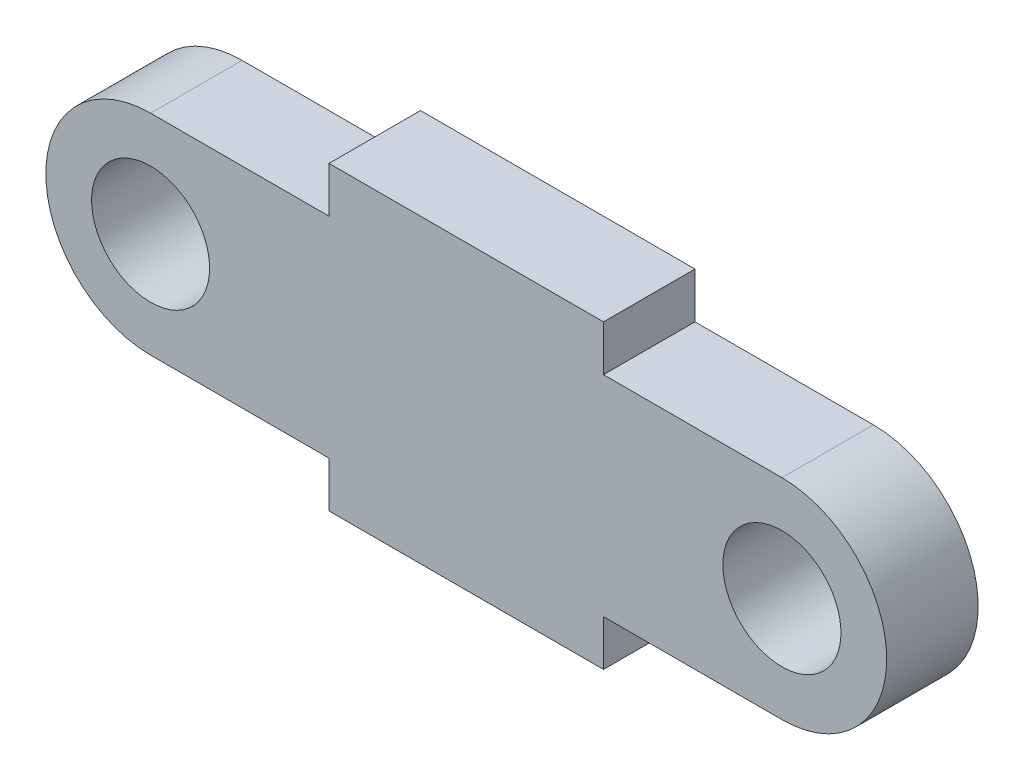
ISO-10303-21;
HEADER;
FILE_DESCRIPTION(('STEP AP214'),'2;1');
FILE_NAME('part.step','',(''),(''),'','','');
FILE_SCHEMA(('AUTOMOTIVE_DESIGN { 1 0 10303 214 1 1 1 1 }'));
ENDSEC;
DATA;
#1=APPLICATION_CONTEXT('core data for automotive mechanical design processes');
#2=APPLICATION_PROTOCOL_DEFINITION('international standard','automotive_design',2000,#1);
#3=PRODUCT_CONTEXT('',#1,'mechanical');
#4=PRODUCT('Part','Part','',(#3));
#5=PRODUCT_RELATED_PRODUCT_CATEGORY('part','',(#4));
#6=PRODUCT_DEFINITION_FORMATION('','',#4);
#7=PRODUCT_DEFINITION_CONTEXT('part definition',#1,'design');
#8=PRODUCT_DEFINITION('design','',#6,#7);
#9=PRODUCT_DEFINITION_SHAPE('','',#8);
#10=(LENGTH_UNIT() NAMED_UNIT(*) SI_UNIT(.MILLI.,.METRE.));
#11=(NAMED_UNIT(*) PLANE_ANGLE_UNIT() SI_UNIT($,.RADIAN.));
#12=(NAMED_UNIT(*) SI_UNIT($,.STERADIAN.) SOLID_ANGLE_UNIT());
#13=UNCERTAINTY_MEASURE_WITH_UNIT(LENGTH_MEASURE(1.E-05),#10,'distance_accuracy_value','');
#14=(GEOMETRIC_REPRESENTATION_CONTEXT(3) GLOBAL_UNCERTAINTY_ASSIGNED_CONTEXT((#13)) GLOBAL_UNIT_ASSIGNED_CONTEXT((#10,
#11,#12)) REPRESENTATION_CONTEXT('',''));
#15=CARTESIAN_POINT('',(0.,0.,0.));
#16=DIRECTION('',(0.,0.,1.));
#17=DIRECTION('',(1.,0.,0.));
#18=AXIS2_PLACEMENT_3D('',#15,#16,#17);
#19=CARTESIAN_POINT('',(-39.6175214332808,0.,-10.));
#20=DIRECTION('',(0.,0.,1.));
#21=DIRECTION('',(1.,0.,0.));
#22=AXIS2_PLACEMENT_3D('',#19,#20,#21);
#23=CYLINDRICAL_SURFACE('',#22,11.45);
#24=CARTESIAN_POINT('',(-39.6175214332808,0.,0.));
#25=DIRECTION('',(0.,0.,1.));
#26=DIRECTION('',(1.,0.,0.));
#27=AXIS2_PLACEMENT_3D('',#24,#25,#26);
#28=CIRCLE('',#27,11.45);
#29=CARTESIAN_POINT('',(-39.6175214332808,11.45,0.));
#30=VERTEX_POINT('',#29);
#31=CARTESIAN_POINT('',(-39.6175214332808,-11.45,0.));
#32=VERTEX_POINT('',#31);
#33=EDGE_CURVE('E166',#30,#32,#28,.T.);
#34=ORIENTED_EDGE('',*,*,#33,.F.);
#35=DIRECTION('',(0.,0.,1.));
#36=VECTOR('',#35,1.);
#37=CARTESIAN_POINT('',(-39.6175214332808,11.45,-10.));
#38=LINE('',#37,#36);
#39=CARTESIAN_POINT('',(-39.6175214332808,11.45,-10.));
#40=VERTEX_POINT('',#39);
#41=EDGE_CURVE('E11',#40,#30,#38,.T.);
#42=ORIENTED_EDGE('',*,*,#41,.F.);
#43=CARTESIAN_POINT('',(-39.6175214332808,0.,-10.));
#44=DIRECTION('',(0.,0.,1.));
#45=DIRECTION('',(1.,0.,0.));
#46=AXIS2_PLACEMENT_3D('',#43,#44,#45);
#47=CIRCLE('',#46,11.45);
#48=CARTESIAN_POINT('',(-39.6175214332808,-11.45,-10.));
#49=VERTEX_POINT('',#48);
#50=EDGE_CURVE('E211',#40,#49,#47,.T.);
#51=ORIENTED_EDGE('',*,*,#50,.T.);
#52=DIRECTION('',(0.,0.,1.));
#53=VECTOR('',#52,1.);
#54=CARTESIAN_POINT('',(-39.6175214332808,-11.45,-10.));
#55=LINE('',#54,#53);
#56=EDGE_CURVE('E42',#49,#32,#55,.T.);
#57=ORIENTED_EDGE('',*,*,#56,.T.);
#58=EDGE_LOOP('',(#34,#42,#51,#57));
#59=FACE_BOUND('',#58,.T.);
#60=ADVANCED_FACE('F39',(#59),#23,.T.);
#61=CARTESIAN_POINT('',(-39.6175214332808,11.45,-10.));
#62=DIRECTION('',(0.,1.,0.));
#63=DIRECTION('',(-1.,0.,0.));
#64=AXIS2_PLACEMENT_3D('',#61,#62,#63);
#65=PLANE('',#64);
#66=DIRECTION('',(-1.,0.,0.));
#67=VECTOR('',#66,1.);
#68=CARTESIAN_POINT('',(-39.6175214332808,11.45,0.));
#69=LINE('',#68,#67);
#70=CARTESIAN_POINT('',(-20.1175214332808,11.45,0.));
#71=VERTEX_POINT('',#70);
#72=EDGE_CURVE('E208',#71,#30,#69,.T.);
#73=ORIENTED_EDGE('',*,*,#72,.F.);
#74=DIRECTION('',(0.,0.,1.));
#75=VECTOR('',#74,1.);
#76=CARTESIAN_POINT('',(-20.1175214332808,11.45,-10.));
#77=LINE('',#76,#75);
#78=CARTESIAN_POINT('',(-20.1175214332808,11.45,-10.));
#79=VERTEX_POINT('',#78);
#80=EDGE_CURVE('E49',#79,#71,#77,.T.);
#81=ORIENTED_EDGE('',*,*,#80,.F.);
#82=DIRECTION('',(-1.,0.,0.));
#83=VECTOR('',#82,1.);
#84=CARTESIAN_POINT('',(-39.6175214332808,11.45,-10.));
#85=LINE('',#84,#83);
#86=EDGE_CURVE('E152',#79,#40,#85,.T.);
#87=ORIENTED_EDGE('',*,*,#86,.T.);
#88=ORIENTED_EDGE('',*,*,#41,.T.);
#89=EDGE_LOOP('',(#73,#81,#87,#88));
#90=FACE_BOUND('',#89,.T.);
#91=ADVANCED_FACE('F241',(#90),#65,.T.);
#92=CARTESIAN_POINT('',(-20.1175214332808,11.45,-10.));
#93=DIRECTION('',(-1.,0.,0.));
#94=DIRECTION('',(0.,-1.,0.));
#95=AXIS2_PLACEMENT_3D('',#92,#93,#94);
#96=PLANE('',#95);
#97=DIRECTION('',(0.,-1.,0.));
#98=VECTOR('',#97,1.);
#99=CARTESIAN_POINT('',(-20.1175214332808,11.45,0.));
#100=LINE('',#99,#98);
#101=CARTESIAN_POINT('',(-20.1175214332808,16.45,0.));
#102=VERTEX_POINT('',#101);
#103=EDGE_CURVE('E138',#102,#71,#100,.T.);
#104=ORIENTED_EDGE('',*,*,#103,.F.);
#105=DIRECTION('',(0.,0.,1.));
#106=VECTOR('',#105,1.);
#107=CARTESIAN_POINT('',(-20.1175214332808,16.45,-10.));
#108=LINE('',#107,#106);
#109=CARTESIAN_POINT('',(-20.1175214332808,16.45,-10.));
#110=VERTEX_POINT('',#109);
#111=EDGE_CURVE('E133',#110,#102,#108,.T.);
#112=ORIENTED_EDGE('',*,*,#111,.F.);
#113=DIRECTION('',(0.,-1.,0.));
#114=VECTOR('',#113,1.);
#115=CARTESIAN_POINT('',(-20.1175214332808,11.45,-10.));
#116=LINE('',#115,#114);
#117=EDGE_CURVE('E136',#110,#79,#116,.T.);
#118=ORIENTED_EDGE('',*,*,#117,.T.);
#119=ORIENTED_EDGE('',*,*,#80,.T.);
#120=EDGE_LOOP('',(#104,#112,#118,#119));
#121=FACE_BOUND('',#120,.T.);
#122=ADVANCED_FACE('F135',(#121),#96,.T.);
#123=CARTESIAN_POINT('',(-20.1175214332808,16.45,-10.));
#124=DIRECTION('',(0.,1.,0.));
#125=DIRECTION('',(-1.,0.,0.));
#126=AXIS2_PLACEMENT_3D('',#123,#124,#125);
#127=PLANE('',#126);
#128=DIRECTION('',(-1.,0.,0.));
#129=VECTOR('',#128,1.);
#130=CARTESIAN_POINT('',(-20.1175214332808,16.45,0.));
#131=LINE('',#130,#129);
#132=CARTESIAN_POINT('',(9.88247856671921,16.45,0.));
#133=VERTEX_POINT('',#132);
#134=EDGE_CURVE('E203',#133,#102,#131,.T.);
#135=ORIENTED_EDGE('',*,*,#134,.F.);
#136=DIRECTION('',(0.,0.,1.));
#137=VECTOR('',#136,1.);
#138=CARTESIAN_POINT('',(9.88247856671921,16.45,-10.));
#139=LINE('',#138,#137);
#140=CARTESIAN_POINT('',(9.88247856671921,16.45,-10.));
#141=VERTEX_POINT('',#140);
#142=EDGE_CURVE('E144',#141,#133,#139,.T.);
#143=ORIENTED_EDGE('',*,*,#142,.F.);
#144=DIRECTION('',(-1.,0.,0.));
#145=VECTOR('',#144,1.);
#146=CARTESIAN_POINT('',(-20.1175214332808,16.45,-10.));
#147=LINE('',#146,#145);
#148=EDGE_CURVE('E150',#141,#110,#147,.T.);
#149=ORIENTED_EDGE('',*,*,#148,.T.);
#150=ORIENTED_EDGE('',*,*,#111,.T.);
#151=EDGE_LOOP('',(#135,#143,#149,#150));
#152=FACE_BOUND('',#151,.T.);
#153=ADVANCED_FACE('F155',(#152),#127,.T.);
#154=CARTESIAN_POINT('',(9.8824785667192,11.45,-10.));
#155=DIRECTION('',(1.,0.,0.));
#156=DIRECTION('',(0.,1.,0.));
#157=AXIS2_PLACEMENT_3D('',#154,#155,#156);
#158=PLANE('',#157);
#159=DIRECTION('',(0.,1.,0.));
#160=VECTOR('',#159,1.);
#161=CARTESIAN_POINT('',(9.8824785667192,11.45,0.));
#162=LINE('',#161,#160);
#163=CARTESIAN_POINT('',(9.8824785667192,11.45,0.));
#164=VERTEX_POINT('',#163);
#165=EDGE_CURVE('E199',#164,#133,#162,.T.);
#166=ORIENTED_EDGE('',*,*,#165,.F.);
#167=DIRECTION('',(0.,0.,1.));
#168=VECTOR('',#167,1.);
#169=CARTESIAN_POINT('',(9.8824785667192,11.45,-10.));
#170=LINE('',#169,#168);
#171=CARTESIAN_POINT('',(9.8824785667192,11.45,-10.));
#172=VERTEX_POINT('',#171);
#173=EDGE_CURVE('E217',#172,#164,#170,.T.);
#174=ORIENTED_EDGE('',*,*,#173,.F.);
#175=DIRECTION('',(0.,1.,0.));
#176=VECTOR('',#175,1.);
#177=CARTESIAN_POINT('',(9.8824785667192,11.45,-10.));
#178=LINE('',#177,#176);
#179=EDGE_CURVE('E157',#172,#141,#178,.T.);
#180=ORIENTED_EDGE('',*,*,#179,.T.);
#181=ORIENTED_EDGE('',*,*,#142,.T.);
#182=EDGE_LOOP('',(#166,#174,#180,#181));
#183=FACE_BOUND('',#182,.T.);
#184=ADVANCED_FACE('F254',(#183),#158,.T.);
#185=CARTESIAN_POINT('',(29.3824785667192,11.45,-10.));
#186=DIRECTION('',(0.,1.,0.));
#187=DIRECTION('',(-1.,0.,0.));
#188=AXIS2_PLACEMENT_3D('',#185,#186,#187);
#189=PLANE('',#188);
#190=DIRECTION('',(-1.,0.,0.));
#191=VECTOR('',#190,1.);
#192=CARTESIAN_POINT('',(29.3824785667192,11.45,0.));
#193=LINE('',#192,#191);
#194=CARTESIAN_POINT('',(29.3824785667192,11.45,0.));
#195=VERTEX_POINT('',#194);
#196=EDGE_CURVE('E195',#195,#164,#193,.T.);
#197=ORIENTED_EDGE('',*,*,#196,.F.);
#198=DIRECTION('',(0.,0.,1.));
#199=VECTOR('',#198,1.);
#200=CARTESIAN_POINT('',(29.3824785667192,11.45,-10.));
#201=LINE('',#200,#199);
#202=CARTESIAN_POINT('',(29.3824785667192,11.45,-10.));
#203=VERTEX_POINT('',#202);
#204=EDGE_CURVE('E220',#203,#195,#201,.T.);
#205=ORIENTED_EDGE('',*,*,#204,.F.);
#206=DIRECTION('',(-1.,0.,0.));
#207=VECTOR('',#206,1.);
#208=CARTESIAN_POINT('',(29.3824785667192,11.45,-10.));
#209=LINE('',#208,#207);
#210=EDGE_CURVE('E160',#203,#172,#209,.T.);
#211=ORIENTED_EDGE('',*,*,#210,.T.);
#212=ORIENTED_EDGE('',*,*,#173,.T.);
#213=EDGE_LOOP('',(#197,#205,#211,#212));
#214=FACE_BOUND('',#213,.T.);
#215=ADVANCED_FACE('F257',(#214),#189,.T.);
#216=CARTESIAN_POINT('',(29.3824785667192,0.,-10.));
#217=DIRECTION('',(0.,0.,1.));
#218=DIRECTION('',(1.,0.,0.));
#219=AXIS2_PLACEMENT_3D('',#216,#217,#218);
#220=CYLINDRICAL_SURFACE('',#219,11.45);
#221=CARTESIAN_POINT('',(29.3824785667192,0.,0.));
#222=DIRECTION('',(0.,0.,1.));
#223=DIRECTION('',(-1.,0.,0.));
#224=AXIS2_PLACEMENT_3D('',#221,#222,#223);
#225=CIRCLE('',#224,11.45);
#226=CARTESIAN_POINT('',(29.3824785667192,-11.45,0.));
#227=VERTEX_POINT('',#226);
#228=EDGE_CURVE('E191',#227,#195,#225,.T.);
#229=ORIENTED_EDGE('',*,*,#228,.F.);
#230=DIRECTION('',(0.,0.,1.));
#231=VECTOR('',#230,1.);
#232=CARTESIAN_POINT('',(29.3824785667192,-11.45,-10.));
#233=LINE('',#232,#231);
#234=CARTESIAN_POINT('',(29.3824785667192,-11.45,-10.));
#235=VERTEX_POINT('',#234);
#236=EDGE_CURVE('E223',#235,#227,#233,.T.);
#237=ORIENTED_EDGE('',*,*,#236,.F.);
#238=CARTESIAN_POINT('',(29.3824785667192,0.,-10.));
#239=DIRECTION('',(0.,0.,1.));
#240=DIRECTION('',(-1.,0.,0.));
#241=AXIS2_PLACEMENT_3D('',#238,#239,#240);
#242=CIRCLE('',#241,11.45);
#243=EDGE_CURVE('E341',#235,#203,#242,.T.);
#244=ORIENTED_EDGE('',*,*,#243,.T.);
#245=ORIENTED_EDGE('',*,*,#204,.T.);
#246=EDGE_LOOP('',(#229,#237,#244,#245));
#247=FACE_BOUND('',#246,.T.);
#248=ADVANCED_FACE('F261',(#247),#220,.T.);
#249=CARTESIAN_POINT('',(29.3824785667192,-11.45,-10.));
#250=DIRECTION('',(0.,-1.,0.));
#251=DIRECTION('',(1.,0.,0.));
#252=AXIS2_PLACEMENT_3D('',#249,#250,#251);
#253=PLANE('',#252);
#254=DIRECTION('',(1.,0.,0.));
#255=VECTOR('',#254,1.);
#256=CARTESIAN_POINT('',(29.3824785667192,-11.45,0.));
#257=LINE('',#256,#255);
#258=CARTESIAN_POINT('',(9.8824785667192,-11.45,0.));
#259=VERTEX_POINT('',#258);
#260=EDGE_CURVE('E187',#259,#227,#257,.T.);
#261=ORIENTED_EDGE('',*,*,#260,.F.);
#262=DIRECTION('',(0.,0.,1.));
#263=VECTOR('',#262,1.);
#264=CARTESIAN_POINT('',(9.8824785667192,-11.45,-10.));
#265=LINE('',#264,#263);
#266=CARTESIAN_POINT('',(9.8824785667192,-11.45,-10.));
#267=VERTEX_POINT('',#266);
#268=EDGE_CURVE('E226',#267,#259,#265,.T.);
#269=ORIENTED_EDGE('',*,*,#268,.F.);
#270=DIRECTION('',(1.,0.,0.));
#271=VECTOR('',#270,1.);
#272=CARTESIAN_POINT('',(29.3824785667192,-11.45,-10.));
#273=LINE('',#272,#271);
#274=EDGE_CURVE('E337',#267,#235,#273,.T.);
#275=ORIENTED_EDGE('',*,*,#274,.T.);
#276=ORIENTED_EDGE('',*,*,#236,.T.);
#277=EDGE_LOOP('',(#261,#269,#275,#276));
#278=FACE_BOUND('',#277,.T.);
#279=ADVANCED_FACE('F265',(#278),#253,.T.);
#280=CARTESIAN_POINT('',(9.8824785667192,-11.45,-10.));
#281=DIRECTION('',(1.,0.,0.));
#282=DIRECTION('',(0.,1.,0.));
#283=AXIS2_PLACEMENT_3D('',#280,#281,#282);
#284=PLANE('',#283);
#285=DIRECTION('',(0.,1.,0.));
#286=VECTOR('',#285,1.);
#287=CARTESIAN_POINT('',(9.8824785667192,-11.45,0.));
#288=LINE('',#287,#286);
#289=CARTESIAN_POINT('',(9.88247856671921,-16.45,0.));
#290=VERTEX_POINT('',#289);
#291=EDGE_CURVE('E183',#290,#259,#288,.T.);
#292=ORIENTED_EDGE('',*,*,#291,.F.);
#293=DIRECTION('',(0.,0.,1.));
#294=VECTOR('',#293,1.);
#295=CARTESIAN_POINT('',(9.88247856671921,-16.45,-10.));
#296=LINE('',#295,#294);
#297=CARTESIAN_POINT('',(9.88247856671921,-16.45,-10.));
#298=VERTEX_POINT('',#297);
#299=EDGE_CURVE('E229',#298,#290,#296,.T.);
#300=ORIENTED_EDGE('',*,*,#299,.F.);
#301=DIRECTION('',(0.,1.,0.));
#302=VECTOR('',#301,1.);
#303=CARTESIAN_POINT('',(9.8824785667192,-11.45,-10.));
#304=LINE('',#303,#302);
#305=EDGE_CURVE('E333',#298,#267,#304,.T.);
#306=ORIENTED_EDGE('',*,*,#305,.T.);
#307=ORIENTED_EDGE('',*,*,#268,.T.);
#308=EDGE_LOOP('',(#292,#300,#306,#307));
#309=FACE_BOUND('',#308,.T.);
#310=ADVANCED_FACE('F269',(#309),#284,.T.);
#311=CARTESIAN_POINT('',(-20.1175214332808,-16.45,-10.));
#312=DIRECTION('',(0.,-1.,0.));
#313=DIRECTION('',(1.,0.,0.));
#314=AXIS2_PLACEMENT_3D('',#311,#312,#313);
#315=PLANE('',#314);
#316=DIRECTION('',(1.,0.,0.));
#317=VECTOR('',#316,1.);
#318=CARTESIAN_POINT('',(-20.1175214332808,-16.45,0.));
#319=LINE('',#318,#317);
#320=CARTESIAN_POINT('',(-20.1175214332808,-16.45,0.));
#321=VERTEX_POINT('',#320);
#322=EDGE_CURVE('E179',#321,#290,#319,.T.);
#323=ORIENTED_EDGE('',*,*,#322,.F.);
#324=DIRECTION('',(0.,0.,1.));
#325=VECTOR('',#324,1.);
#326=CARTESIAN_POINT('',(-20.1175214332808,-16.45,-10.));
#327=LINE('',#326,#325);
#328=CARTESIAN_POINT('',(-20.1175214332808,-16.45,-10.));
#329=VERTEX_POINT('',#328);
#330=EDGE_CURVE('E232',#329,#321,#327,.T.);
#331=ORIENTED_EDGE('',*,*,#330,.F.);
#332=DIRECTION('',(1.,0.,0.));
#333=VECTOR('',#332,1.);
#334=CARTESIAN_POINT('',(-20.1175214332808,-16.45,-10.));
#335=LINE('',#334,#333);
#336=EDGE_CURVE('E329',#329,#298,#335,.T.);
#337=ORIENTED_EDGE('',*,*,#336,.T.);
#338=ORIENTED_EDGE('',*,*,#299,.T.);
#339=EDGE_LOOP('',(#323,#331,#337,#338));
#340=FACE_BOUND('',#339,.T.);
#341=ADVANCED_FACE('F273',(#340),#315,.T.);
#342=CARTESIAN_POINT('',(-20.1175214332808,-11.45,-10.));
#343=DIRECTION('',(-1.,0.,0.));
#344=DIRECTION('',(0.,-1.,0.));
#345=AXIS2_PLACEMENT_3D('',#342,#343,#344);
#346=PLANE('',#345);
#347=DIRECTION('',(0.,-1.,0.));
#348=VECTOR('',#347,1.);
#349=CARTESIAN_POINT('',(-20.1175214332808,-11.45,0.));
#350=LINE('',#349,#348);
#351=CARTESIAN_POINT('',(-20.1175214332808,-11.45,0.));
#352=VERTEX_POINT('',#351);
#353=EDGE_CURVE('E175',#352,#321,#350,.T.);
#354=ORIENTED_EDGE('',*,*,#353,.F.);
#355=DIRECTION('',(0.,0.,1.));
#356=VECTOR('',#355,1.);
#357=CARTESIAN_POINT('',(-20.1175214332808,-11.45,-10.));
#358=LINE('',#357,#356);
#359=CARTESIAN_POINT('',(-20.1175214332808,-11.45,-10.));
#360=VERTEX_POINT('',#359);
#361=EDGE_CURVE('E234',#360,#352,#358,.T.);
#362=ORIENTED_EDGE('',*,*,#361,.F.);
#363=DIRECTION('',(0.,-1.,0.));
#364=VECTOR('',#363,1.);
#365=CARTESIAN_POINT('',(-20.1175214332808,-11.45,-10.));
#366=LINE('',#365,#364);
#367=EDGE_CURVE('E325',#360,#329,#366,.T.);
#368=ORIENTED_EDGE('',*,*,#367,.T.);
#369=ORIENTED_EDGE('',*,*,#330,.T.);
#370=EDGE_LOOP('',(#354,#362,#368,#369));
#371=FACE_BOUND('',#370,.T.);
#372=ADVANCED_FACE('F277',(#371),#346,.T.);
#373=CARTESIAN_POINT('',(-39.6175214332808,-11.45,-10.));
#374=DIRECTION('',(0.,-1.,0.));
#375=DIRECTION('',(1.,0.,0.));
#376=AXIS2_PLACEMENT_3D('',#373,#374,#375);
#377=PLANE('',#376);
#378=DIRECTION('',(1.,0.,0.));
#379=VECTOR('',#378,1.);
#380=CARTESIAN_POINT('',(-39.6175214332808,-11.45,0.));
#381=LINE('',#380,#379);
#382=EDGE_CURVE('E170',#32,#352,#381,.T.);
#383=ORIENTED_EDGE('',*,*,#382,.F.);
#384=ORIENTED_EDGE('',*,*,#56,.F.);
#385=DIRECTION('',(1.,0.,0.));
#386=VECTOR('',#385,1.);
#387=CARTESIAN_POINT('',(-39.6175214332808,-11.45,-10.));
#388=LINE('',#387,#386);
#389=EDGE_CURVE('E322',#49,#360,#388,.T.);
#390=ORIENTED_EDGE('',*,*,#389,.T.);
#391=ORIENTED_EDGE('',*,*,#361,.T.);
#392=EDGE_LOOP('',(#383,#384,#390,#391));
#393=FACE_BOUND('',#392,.T.);
#394=ADVANCED_FACE('F238',(#393),#377,.T.);
#395=CARTESIAN_POINT('',(-39.6175214332808,0.,-10.));
#396=DIRECTION('',(0.,0.,1.));
#397=DIRECTION('',(1.,0.,0.));
#398=AXIS2_PLACEMENT_3D('',#395,#396,#397);
#399=PLANE('',#398);
#400=CARTESIAN_POINT('',(29.3824785667192,0.,-10.));
#401=DIRECTION('',(0.,0.,1.));
#402=DIRECTION('',(-1.,0.,0.));
#403=AXIS2_PLACEMENT_3D('',#400,#401,#402);
#404=CIRCLE('',#403,6.45);
#405=CARTESIAN_POINT('',(22.9324785667192,0.,-10.));
#406=VERTEX_POINT('',#405);
#407=EDGE_CURVE('E304',#406,#406,#404,.T.);
#408=ORIENTED_EDGE('',*,*,#407,.T.);
#409=EDGE_LOOP('',(#408));
#410=FACE_BOUND('',#409,.T.);
#411=CARTESIAN_POINT('',(-39.6175214332808,0.,-10.));
#412=DIRECTION('',(0.,0.,1.));
#413=DIRECTION('',(1.,0.,0.));
#414=AXIS2_PLACEMENT_3D('',#411,#412,#413);
#415=CIRCLE('',#414,6.45);
#416=CARTESIAN_POINT('',(-33.1675214332808,0.,-10.));
#417=VERTEX_POINT('',#416);
#418=EDGE_CURVE('E171',#417,#417,#415,.T.);
#419=ORIENTED_EDGE('',*,*,#418,.T.);
#420=EDGE_LOOP('',(#419));
#421=FACE_BOUND('',#420,.T.);
#422=ORIENTED_EDGE('',*,*,#50,.F.);
#423=ORIENTED_EDGE('',*,*,#86,.F.);
#424=ORIENTED_EDGE('',*,*,#117,.F.);
#425=ORIENTED_EDGE('',*,*,#148,.F.);
#426=ORIENTED_EDGE('',*,*,#179,.F.);
#427=ORIENTED_EDGE('',*,*,#210,.F.);
#428=ORIENTED_EDGE('',*,*,#243,.F.);
#429=ORIENTED_EDGE('',*,*,#274,.F.);
#430=ORIENTED_EDGE('',*,*,#305,.F.);
#431=ORIENTED_EDGE('',*,*,#336,.F.);
#432=ORIENTED_EDGE('',*,*,#367,.F.);
#433=ORIENTED_EDGE('',*,*,#389,.F.);
#434=EDGE_LOOP('',(#422,#423,#424,#425,#426,#427,#428,#429,#430,#431,#432,#433));
#435=FACE_BOUND('',#434,.T.);
#436=ADVANCED_FACE('F148',(#410,#421,#435),#399,.F.);
#437=CARTESIAN_POINT('',(-39.6175214332808,0.,0.));
#438=DIRECTION('',(0.,0.,1.));
#439=DIRECTION('',(1.,0.,0.));
#440=AXIS2_PLACEMENT_3D('',#437,#438,#439);
#441=PLANE('',#440);
#442=CARTESIAN_POINT('',(29.3824785667192,0.,0.));
#443=DIRECTION('',(0.,0.,1.));
#444=DIRECTION('',(-1.,0.,0.));
#445=AXIS2_PLACEMENT_3D('',#442,#443,#444);
#446=CIRCLE('',#445,6.45);
#447=CARTESIAN_POINT('',(22.9324785667192,0.,0.));
#448=VERTEX_POINT('',#447);
#449=EDGE_CURVE('E307',#448,#448,#446,.T.);
#450=ORIENTED_EDGE('',*,*,#449,.F.);
#451=EDGE_LOOP('',(#450));
#452=FACE_BOUND('',#451,.T.);
#453=CARTESIAN_POINT('',(-39.6175214332808,0.,0.));
#454=DIRECTION('',(0.,0.,1.));
#455=DIRECTION('',(1.,0.,0.));
#456=AXIS2_PLACEMENT_3D('',#453,#454,#455);
#457=CIRCLE('',#456,6.45);
#458=CARTESIAN_POINT('',(-33.1675214332808,0.,0.));
#459=VERTEX_POINT('',#458);
#460=EDGE_CURVE('E311',#459,#459,#457,.T.);
#461=ORIENTED_EDGE('',*,*,#460,.F.);
#462=EDGE_LOOP('',(#461));
#463=FACE_BOUND('',#462,.T.);
#464=ORIENTED_EDGE('',*,*,#33,.T.);
#465=ORIENTED_EDGE('',*,*,#382,.T.);
#466=ORIENTED_EDGE('',*,*,#353,.T.);
#467=ORIENTED_EDGE('',*,*,#322,.T.);
#468=ORIENTED_EDGE('',*,*,#291,.T.);
#469=ORIENTED_EDGE('',*,*,#260,.T.);
#470=ORIENTED_EDGE('',*,*,#228,.T.);
#471=ORIENTED_EDGE('',*,*,#196,.T.);
#472=ORIENTED_EDGE('',*,*,#165,.T.);
#473=ORIENTED_EDGE('',*,*,#134,.T.);
#474=ORIENTED_EDGE('',*,*,#103,.T.);
#475=ORIENTED_EDGE('',*,*,#72,.T.);
#476=EDGE_LOOP('',(#464,#465,#466,#467,#468,#469,#470,#471,#472,#473,#474,#475));
#477=FACE_BOUND('',#476,.T.);
#478=ADVANCED_FACE('F240',(#452,#463,#477),#441,.T.);
#479=CARTESIAN_POINT('',(-39.6175214332808,0.,-10.));
#480=DIRECTION('',(0.,0.,1.));
#481=DIRECTION('',(1.,0.,0.));
#482=AXIS2_PLACEMENT_3D('',#479,#480,#481);
#483=CYLINDRICAL_SURFACE('',#482,6.45);
#484=ORIENTED_EDGE('',*,*,#418,.F.);
#485=EDGE_LOOP('',(#484));
#486=FACE_BOUND('',#485,.T.);
#487=ORIENTED_EDGE('',*,*,#460,.T.);
#488=EDGE_LOOP('',(#487));
#489=FACE_BOUND('',#488,.T.);
#490=ADVANCED_FACE('F289',(#486,#489),#483,.F.);
#491=CARTESIAN_POINT('',(29.3824785667192,0.,-10.));
#492=DIRECTION('',(0.,0.,1.));
#493=DIRECTION('',(1.,0.,0.));
#494=AXIS2_PLACEMENT_3D('',#491,#492,#493);
#495=CYLINDRICAL_SURFACE('',#494,6.45);
#496=ORIENTED_EDGE('',*,*,#407,.F.);
#497=EDGE_LOOP('',(#496));
#498=FACE_BOUND('',#497,.T.);
#499=ORIENTED_EDGE('',*,*,#449,.T.);
#500=EDGE_LOOP('',(#499));
#501=FACE_BOUND('',#500,.T.);
#502=ADVANCED_FACE('F296',(#498,#501),#495,.F.);
#503=CLOSED_SHELL('',(#60,#91,#122,#153,#184,#215,#248,#279,#310,#341,#372,#394,#436,#478,#490,#502));
#504=MANIFOLD_SOLID_BREP('B2',#503);
#505=ADVANCED_BREP_SHAPE_REPRESENTATION('',(#18,#504),#14);
#506=SHAPE_DEFINITION_REPRESENTATION(#9,#505);
ENDSEC;
END-ISO-10303-21;
